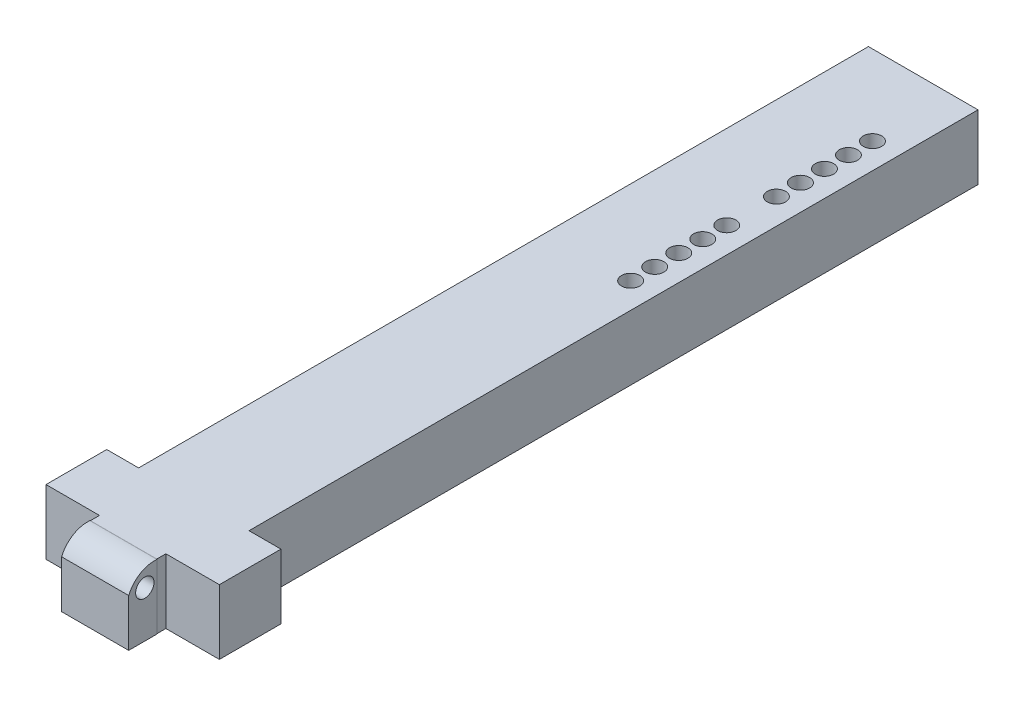
ISO-10303-21;
HEADER;
FILE_DESCRIPTION(('STEP AP214'),'2;1');
FILE_NAME('part.step','',(''),(''),'','','');
FILE_SCHEMA(('AUTOMOTIVE_DESIGN { 1 0 10303 214 1 1 1 1 }'));
ENDSEC;
DATA;
#1=APPLICATION_CONTEXT('core data for automotive mechanical design processes');
#2=APPLICATION_PROTOCOL_DEFINITION('international standard','automotive_design',2000,#1);
#3=PRODUCT_CONTEXT('',#1,'mechanical');
#4=PRODUCT('Part','Part','',(#3));
#5=PRODUCT_RELATED_PRODUCT_CATEGORY('part','',(#4));
#6=PRODUCT_DEFINITION_FORMATION('','',#4);
#7=PRODUCT_DEFINITION_CONTEXT('part definition',#1,'design');
#8=PRODUCT_DEFINITION('design','',#6,#7);
#9=PRODUCT_DEFINITION_SHAPE('','',#8);
#10=(LENGTH_UNIT() NAMED_UNIT(*) SI_UNIT(.MILLI.,.METRE.));
#11=(NAMED_UNIT(*) PLANE_ANGLE_UNIT() SI_UNIT($,.RADIAN.));
#12=(NAMED_UNIT(*) SI_UNIT($,.STERADIAN.) SOLID_ANGLE_UNIT());
#13=UNCERTAINTY_MEASURE_WITH_UNIT(LENGTH_MEASURE(1.E-05),#10,'distance_accuracy_value','');
#14=(GEOMETRIC_REPRESENTATION_CONTEXT(3) GLOBAL_UNCERTAINTY_ASSIGNED_CONTEXT((#13)) GLOBAL_UNIT_ASSIGNED_CONTEXT((#10,
#11,#12)) REPRESENTATION_CONTEXT('',''));
#15=CARTESIAN_POINT('',(0.,0.,0.));
#16=DIRECTION('',(0.,0.,1.));
#17=DIRECTION('',(1.,0.,0.));
#18=AXIS2_PLACEMENT_3D('',#15,#16,#17);
#19=CARTESIAN_POINT('',(0.,12.,0.));
#20=DIRECTION('',(0.,-1.,0.));
#21=DIRECTION('',(0.,0.,-1.));
#22=AXIS2_PLACEMENT_3D('',#19,#20,#21);
#23=PLANE('',#22);
#24=DIRECTION('',(0.,0.,1.));
#25=VECTOR('',#24,1.);
#26=CARTESIAN_POINT('',(-10.15,12.,-81.2029529089464));
#27=LINE('',#26,#25);
#28=CARTESIAN_POINT('',(-10.15,12.,-81.2029529089464));
#29=VERTEX_POINT('',#28);
#30=CARTESIAN_POINT('',(-10.15,12.,54.0044271440087));
#31=VERTEX_POINT('',#30);
#32=EDGE_CURVE('E200',#29,#31,#27,.T.);
#33=ORIENTED_EDGE('',*,*,#32,.T.);
#34=DIRECTION('',(-1.,0.,0.));
#35=VECTOR('',#34,1.);
#36=CARTESIAN_POINT('',(-10.15,12.,54.0044271440087));
#37=LINE('',#36,#35);
#38=CARTESIAN_POINT('',(-16.06,12.,54.0044271440087));
#39=VERTEX_POINT('',#38);
#40=EDGE_CURVE('E112',#31,#39,#37,.T.);
#41=ORIENTED_EDGE('',*,*,#40,.T.);
#42=DIRECTION('',(0.,0.,1.));
#43=VECTOR('',#42,1.);
#44=CARTESIAN_POINT('',(-16.06,12.,54.0044271440087));
#45=LINE('',#44,#43);
#46=CARTESIAN_POINT('',(-16.06,12.,65.2544271440087));
#47=VERTEX_POINT('',#46);
#48=EDGE_CURVE('E236',#39,#47,#45,.T.);
#49=ORIENTED_EDGE('',*,*,#48,.T.);
#50=DIRECTION('',(1.,0.,0.));
#51=VECTOR('',#50,1.);
#52=CARTESIAN_POINT('',(-6.15,12.,65.2544271440087));
#53=LINE('',#52,#51);
#54=CARTESIAN_POINT('',(-6.15,12.,65.2544271440087));
#55=VERTEX_POINT('',#54);
#56=EDGE_CURVE('E256',#47,#55,#53,.T.);
#57=ORIENTED_EDGE('',*,*,#56,.T.);
#58=DIRECTION('',(0.,0.,1.));
#59=VECTOR('',#58,1.);
#60=CARTESIAN_POINT('',(-6.15,12.,66.9344271440087));
#61=LINE('',#60,#59);
#62=CARTESIAN_POINT('',(-6.15,12.,66.9344271440087));
#63=VERTEX_POINT('',#62);
#64=EDGE_CURVE('E252',#55,#63,#61,.T.);
#65=ORIENTED_EDGE('',*,*,#64,.T.);
#66=DIRECTION('',(1.,0.,0.));
#67=VECTOR('',#66,1.);
#68=CARTESIAN_POINT('',(-6.15,12.,66.9344271440087));
#69=LINE('',#68,#67);
#70=CARTESIAN_POINT('',(6.15000000000001,12.,66.9344271440087));
#71=VERTEX_POINT('',#70);
#72=EDGE_CURVE('E255',#63,#71,#69,.T.);
#73=ORIENTED_EDGE('',*,*,#72,.T.);
#74=DIRECTION('',(0.,0.,-1.));
#75=VECTOR('',#74,1.);
#76=CARTESIAN_POINT('',(6.15000000000001,12.,65.2544271440087));
#77=LINE('',#76,#75);
#78=CARTESIAN_POINT('',(6.15000000000001,12.,65.2544271440087));
#79=VERTEX_POINT('',#78);
#80=EDGE_CURVE('E260',#71,#79,#77,.T.);
#81=ORIENTED_EDGE('',*,*,#80,.T.);
#82=DIRECTION('',(1.,0.,0.));
#83=VECTOR('',#82,1.);
#84=CARTESIAN_POINT('',(16.06,12.,65.2544271440087));
#85=LINE('',#84,#83);
#86=CARTESIAN_POINT('',(16.06,12.,65.2544271440087));
#87=VERTEX_POINT('',#86);
#88=EDGE_CURVE('E267',#79,#87,#85,.T.);
#89=ORIENTED_EDGE('',*,*,#88,.T.);
#90=DIRECTION('',(0.,0.,-1.));
#91=VECTOR('',#90,1.);
#92=CARTESIAN_POINT('',(16.06,12.,65.2544271440087));
#93=LINE('',#92,#91);
#94=CARTESIAN_POINT('',(16.06,12.,53.848636554426));
#95=VERTEX_POINT('',#94);
#96=EDGE_CURVE('E145',#87,#95,#93,.T.);
#97=ORIENTED_EDGE('',*,*,#96,.T.);
#98=DIRECTION('',(-1.,0.,0.));
#99=VECTOR('',#98,1.);
#100=CARTESIAN_POINT('',(16.06,12.,53.848636554426));
#101=LINE('',#100,#99);
#102=CARTESIAN_POINT('',(10.15,12.,53.848636554426));
#103=VERTEX_POINT('',#102);
#104=EDGE_CURVE('E139',#95,#103,#101,.T.);
#105=ORIENTED_EDGE('',*,*,#104,.T.);
#106=DIRECTION('',(0.,0.,-1.));
#107=VECTOR('',#106,1.);
#108=CARTESIAN_POINT('',(10.15,12.,-81.2029529089464));
#109=LINE('',#108,#107);
#110=CARTESIAN_POINT('',(10.15,12.,-81.2029529089464));
#111=VERTEX_POINT('',#110);
#112=EDGE_CURVE('E143',#103,#111,#109,.T.);
#113=ORIENTED_EDGE('',*,*,#112,.T.);
#114=DIRECTION('',(-1.,0.,0.));
#115=VECTOR('',#114,1.);
#116=CARTESIAN_POINT('',(-10.15,12.,-81.2029529089464));
#117=LINE('',#116,#115);
#118=EDGE_CURVE('E59',#111,#29,#117,.T.);
#119=ORIENTED_EDGE('',*,*,#118,.T.);
#120=EDGE_LOOP('',(#33,#41,#49,#57,#65,#73,#81,#89,#97,#105,#113,#119));
#121=FACE_BOUND('',#120,.T.);
#122=CARTESIAN_POINT('',(5.39999999999999,12.,-48.60403469007));
#123=DIRECTION('',(0.,1.,0.));
#124=DIRECTION('',(0.,0.,1.));
#125=AXIS2_PLACEMENT_3D('',#122,#123,#124);
#126=CIRCLE('',#125,1.7);
#127=CARTESIAN_POINT('',(5.39999999999999,12.,-46.90403469007));
#128=VERTEX_POINT('',#127);
#129=EDGE_CURVE('E172',#128,#128,#126,.T.);
#130=ORIENTED_EDGE('',*,*,#129,.F.);
#131=EDGE_LOOP('',(#130));
#132=FACE_BOUND('',#131,.T.);
#133=CARTESIAN_POINT('',(5.39999999999999,12.,-57.5040346889464));
#134=DIRECTION('',(0.,1.,0.));
#135=DIRECTION('',(0.,0.,1.));
#136=AXIS2_PLACEMENT_3D('',#133,#134,#135);
#137=CIRCLE('',#136,1.7);
#138=CARTESIAN_POINT('',(5.39999999999999,12.,-55.8040346889464));
#139=VERTEX_POINT('',#138);
#140=EDGE_CURVE('E508',#139,#139,#137,.T.);
#141=ORIENTED_EDGE('',*,*,#140,.F.);
#142=EDGE_LOOP('',(#141));
#143=FACE_BOUND('',#142,.T.);
#144=CARTESIAN_POINT('',(5.39999999999999,12.,-30.5040346889464));
#145=DIRECTION('',(0.,1.,0.));
#146=DIRECTION('',(0.,0.,1.));
#147=AXIS2_PLACEMENT_3D('',#144,#145,#146);
#148=CIRCLE('',#147,1.7);
#149=CARTESIAN_POINT('',(5.39999999999999,12.,-28.8040346889464));
#150=VERTEX_POINT('',#149);
#151=EDGE_CURVE('E500',#150,#150,#148,.T.);
#152=ORIENTED_EDGE('',*,*,#151,.F.);
#153=EDGE_LOOP('',(#152));
#154=FACE_BOUND('',#153,.T.);
#155=CARTESIAN_POINT('',(5.40009999999999,12.,-53.0540346889464));
#156=DIRECTION('',(0.,1.,0.));
#157=DIRECTION('',(0.,0.,1.));
#158=AXIS2_PLACEMENT_3D('',#155,#156,#157);
#159=CIRCLE('',#158,1.7);
#160=CARTESIAN_POINT('',(5.40009999999999,12.,-51.3540346889464));
#161=VERTEX_POINT('',#160);
#162=EDGE_CURVE('E492',#161,#161,#159,.T.);
#163=ORIENTED_EDGE('',*,*,#162,.F.);
#164=EDGE_LOOP('',(#163));
#165=FACE_BOUND('',#164,.T.);
#166=CARTESIAN_POINT('',(5.40009999999999,12.,-26.0540346889464));
#167=DIRECTION('',(0.,1.,0.));
#168=DIRECTION('',(0.,0.,1.));
#169=AXIS2_PLACEMENT_3D('',#166,#167,#168);
#170=CIRCLE('',#169,1.7);
#171=CARTESIAN_POINT('',(5.40009999999999,12.,-24.3540346889464));
#172=VERTEX_POINT('',#171);
#173=EDGE_CURVE('E484',#172,#172,#170,.T.);
#174=ORIENTED_EDGE('',*,*,#173,.F.);
#175=EDGE_LOOP('',(#174));
#176=FACE_BOUND('',#175,.T.);
#177=CARTESIAN_POINT('',(5.39999999999999,12.,-61.9540346889464));
#178=DIRECTION('',(0.,1.,0.));
#179=DIRECTION('',(0.,0.,1.));
#180=AXIS2_PLACEMENT_3D('',#177,#178,#179);
#181=CIRCLE('',#180,1.7);
#182=CARTESIAN_POINT('',(5.39999999999999,12.,-60.2540346889464));
#183=VERTEX_POINT('',#182);
#184=EDGE_CURVE('E476',#183,#183,#181,.T.);
#185=ORIENTED_EDGE('',*,*,#184,.F.);
#186=EDGE_LOOP('',(#185));
#187=FACE_BOUND('',#186,.T.);
#188=CARTESIAN_POINT('',(5.39994999999999,12.,-34.9540346889464));
#189=DIRECTION('',(0.,1.,0.));
#190=DIRECTION('',(0.,0.,1.));
#191=AXIS2_PLACEMENT_3D('',#188,#189,#190);
#192=CIRCLE('',#191,1.7);
#193=CARTESIAN_POINT('',(5.39994999999999,12.,-33.2540346889464));
#194=VERTEX_POINT('',#193);
#195=EDGE_CURVE('E468',#194,#194,#192,.T.);
#196=ORIENTED_EDGE('',*,*,#195,.F.);
#197=EDGE_LOOP('',(#196));
#198=FACE_BOUND('',#197,.T.);
#199=CARTESIAN_POINT('',(5.40004999999999,12.,-66.4040346886655));
#200=DIRECTION('',(0.,1.,0.));
#201=DIRECTION('',(0.,0.,1.));
#202=AXIS2_PLACEMENT_3D('',#199,#200,#201);
#203=CIRCLE('',#202,1.70000000000001);
#204=CARTESIAN_POINT('',(5.40004999999999,12.,-64.7040346886654));
#205=VERTEX_POINT('',#204);
#206=EDGE_CURVE('E460',#205,#205,#203,.T.);
#207=ORIENTED_EDGE('',*,*,#206,.F.);
#208=EDGE_LOOP('',(#207));
#209=FACE_BOUND('',#208,.T.);
#210=CARTESIAN_POINT('',(5.39999999999999,12.,-21.60403469007));
#211=DIRECTION('',(0.,1.,0.));
#212=DIRECTION('',(0.,0.,1.));
#213=AXIS2_PLACEMENT_3D('',#210,#211,#212);
#214=CIRCLE('',#213,1.7);
#215=CARTESIAN_POINT('',(5.39999999999999,12.,-19.90403469007));
#216=VERTEX_POINT('',#215);
#217=EDGE_CURVE('E452',#216,#216,#214,.T.);
#218=ORIENTED_EDGE('',*,*,#217,.F.);
#219=EDGE_LOOP('',(#218));
#220=FACE_BOUND('',#219,.T.);
#221=CARTESIAN_POINT('',(5.39999999999999,12.,-39.4040346886655));
#222=DIRECTION('',(0.,1.,0.));
#223=DIRECTION('',(0.,0.,1.));
#224=AXIS2_PLACEMENT_3D('',#221,#222,#223);
#225=CIRCLE('',#224,1.7);
#226=CARTESIAN_POINT('',(5.39999999999999,12.,-37.7040346886655));
#227=VERTEX_POINT('',#226);
#228=EDGE_CURVE('E444',#227,#227,#225,.T.);
#229=ORIENTED_EDGE('',*,*,#228,.F.);
#230=EDGE_LOOP('',(#229));
#231=FACE_BOUND('',#230,.T.);
#232=ADVANCED_FACE('F41',(#121,#132,#143,#154,#165,#176,#187,#198,#209,#220,#231),#23,.F.);
#233=CARTESIAN_POINT('',(0.,0.,0.));
#234=DIRECTION('',(0.,-1.,0.));
#235=DIRECTION('',(0.,0.,-1.));
#236=AXIS2_PLACEMENT_3D('',#233,#234,#235);
#237=PLANE('',#236);
#238=CARTESIAN_POINT('',(5.39999999999999,0.,-21.60403469007));
#239=DIRECTION('',(0.,1.,0.));
#240=DIRECTION('',(0.,0.,1.));
#241=AXIS2_PLACEMENT_3D('',#238,#239,#240);
#242=CIRCLE('',#241,1.7);
#243=CARTESIAN_POINT('',(5.39999999999999,0.,-19.90403469007));
#244=VERTEX_POINT('',#243);
#245=EDGE_CURVE('E448',#244,#244,#242,.T.);
#246=ORIENTED_EDGE('',*,*,#245,.T.);
#247=EDGE_LOOP('',(#246));
#248=FACE_BOUND('',#247,.T.);
#249=CARTESIAN_POINT('',(5.39994999999999,0.,-34.9540346889464));
#250=DIRECTION('',(0.,1.,0.));
#251=DIRECTION('',(0.,0.,1.));
#252=AXIS2_PLACEMENT_3D('',#249,#250,#251);
#253=CIRCLE('',#252,1.7);
#254=CARTESIAN_POINT('',(5.39994999999999,0.,-33.2540346889464));
#255=VERTEX_POINT('',#254);
#256=EDGE_CURVE('E464',#255,#255,#253,.T.);
#257=ORIENTED_EDGE('',*,*,#256,.T.);
#258=EDGE_LOOP('',(#257));
#259=FACE_BOUND('',#258,.T.);
#260=CARTESIAN_POINT('',(5.40009999999999,0.,-26.0540346889464));
#261=DIRECTION('',(0.,1.,0.));
#262=DIRECTION('',(0.,0.,1.));
#263=AXIS2_PLACEMENT_3D('',#260,#261,#262);
#264=CIRCLE('',#263,1.7);
#265=CARTESIAN_POINT('',(5.40009999999999,0.,-24.3540346889464));
#266=VERTEX_POINT('',#265);
#267=EDGE_CURVE('E480',#266,#266,#264,.T.);
#268=ORIENTED_EDGE('',*,*,#267,.T.);
#269=EDGE_LOOP('',(#268));
#270=FACE_BOUND('',#269,.T.);
#271=CARTESIAN_POINT('',(5.39999999999999,0.,-30.5040346889464));
#272=DIRECTION('',(0.,1.,0.));
#273=DIRECTION('',(0.,0.,1.));
#274=AXIS2_PLACEMENT_3D('',#271,#272,#273);
#275=CIRCLE('',#274,1.7);
#276=CARTESIAN_POINT('',(5.39999999999999,0.,-28.8040346889464));
#277=VERTEX_POINT('',#276);
#278=EDGE_CURVE('E496',#277,#277,#275,.T.);
#279=ORIENTED_EDGE('',*,*,#278,.T.);
#280=EDGE_LOOP('',(#279));
#281=FACE_BOUND('',#280,.T.);
#282=CARTESIAN_POINT('',(5.39999999999999,0.,-48.60403469007));
#283=DIRECTION('',(0.,1.,0.));
#284=DIRECTION('',(0.,0.,1.));
#285=AXIS2_PLACEMENT_3D('',#282,#283,#284);
#286=CIRCLE('',#285,1.7);
#287=CARTESIAN_POINT('',(5.39999999999999,0.,-46.90403469007));
#288=VERTEX_POINT('',#287);
#289=EDGE_CURVE('E512',#288,#288,#286,.T.);
#290=ORIENTED_EDGE('',*,*,#289,.T.);
#291=EDGE_LOOP('',(#290));
#292=FACE_BOUND('',#291,.T.);
#293=DIRECTION('',(0.,0.,1.));
#294=VECTOR('',#293,1.);
#295=CARTESIAN_POINT('',(-10.15,0.,-81.2029529089464));
#296=LINE('',#295,#294);
#297=CARTESIAN_POINT('',(-10.15,0.,-81.2029529089464));
#298=VERTEX_POINT('',#297);
#299=CARTESIAN_POINT('',(-10.15,0.,54.0044271440087));
#300=VERTEX_POINT('',#299);
#301=EDGE_CURVE('E167',#298,#300,#296,.T.);
#302=ORIENTED_EDGE('',*,*,#301,.F.);
#303=DIRECTION('',(-1.,0.,0.));
#304=VECTOR('',#303,1.);
#305=CARTESIAN_POINT('',(-10.15,0.,-81.2029529089464));
#306=LINE('',#305,#304);
#307=CARTESIAN_POINT('',(10.15,0.,-81.2029529089464));
#308=VERTEX_POINT('',#307);
#309=EDGE_CURVE('E104',#308,#298,#306,.T.);
#310=ORIENTED_EDGE('',*,*,#309,.F.);
#311=DIRECTION('',(0.,0.,-1.));
#312=VECTOR('',#311,1.);
#313=CARTESIAN_POINT('',(10.15,0.,-81.2029529089464));
#314=LINE('',#313,#312);
#315=CARTESIAN_POINT('',(10.15,0.,53.848636554426));
#316=VERTEX_POINT('',#315);
#317=EDGE_CURVE('E98',#316,#308,#314,.T.);
#318=ORIENTED_EDGE('',*,*,#317,.F.);
#319=DIRECTION('',(-1.,0.,0.));
#320=VECTOR('',#319,1.);
#321=CARTESIAN_POINT('',(16.06,0.,53.848636554426));
#322=LINE('',#321,#320);
#323=CARTESIAN_POINT('',(16.06,0.,53.848636554426));
#324=VERTEX_POINT('',#323);
#325=EDGE_CURVE('E154',#324,#316,#322,.T.);
#326=ORIENTED_EDGE('',*,*,#325,.F.);
#327=DIRECTION('',(0.,0.,-1.));
#328=VECTOR('',#327,1.);
#329=CARTESIAN_POINT('',(16.06,0.,65.2544271440087));
#330=LINE('',#329,#328);
#331=CARTESIAN_POINT('',(16.06,0.,65.2544271440087));
#332=VERTEX_POINT('',#331);
#333=EDGE_CURVE('E191',#332,#324,#330,.T.);
#334=ORIENTED_EDGE('',*,*,#333,.F.);
#335=DIRECTION('',(1.,0.,0.));
#336=VECTOR('',#335,1.);
#337=CARTESIAN_POINT('',(16.06,0.,65.2544271440087));
#338=LINE('',#337,#336);
#339=CARTESIAN_POINT('',(6.15000000000001,0.,65.2544271440087));
#340=VERTEX_POINT('',#339);
#341=EDGE_CURVE('E188',#340,#332,#338,.T.);
#342=ORIENTED_EDGE('',*,*,#341,.F.);
#343=DIRECTION('',(0.,0.,-1.));
#344=VECTOR('',#343,1.);
#345=CARTESIAN_POINT('',(6.15000000000001,0.,65.2544271440087));
#346=LINE('',#345,#344);
#347=CARTESIAN_POINT('',(6.15000000000001,0.,66.9344271440087));
#348=VERTEX_POINT('',#347);
#349=EDGE_CURVE('E185',#348,#340,#346,.T.);
#350=ORIENTED_EDGE('',*,*,#349,.F.);
#351=DIRECTION('',(-1.,0.,0.));
#352=VECTOR('',#351,1.);
#353=CARTESIAN_POINT('',(6.2125,0.,66.9344271440087));
#354=LINE('',#353,#352);
#355=CARTESIAN_POINT('',(6.2125,0.,66.9344271440087));
#356=VERTEX_POINT('',#355);
#357=EDGE_CURVE('E435',#356,#348,#354,.T.);
#358=ORIENTED_EDGE('',*,*,#357,.F.);
#359=DIRECTION('',(0.,0.,-1.));
#360=VECTOR('',#359,1.);
#361=CARTESIAN_POINT('',(6.2125,0.,66.9344271440087));
#362=LINE('',#361,#360);
#363=CARTESIAN_POINT('',(6.2125,0.,72.2072929333866));
#364=VERTEX_POINT('',#363);
#365=EDGE_CURVE('E386',#364,#356,#362,.T.);
#366=ORIENTED_EDGE('',*,*,#365,.F.);
#367=DIRECTION('',(-1.,0.,0.));
#368=VECTOR('',#367,1.);
#369=CARTESIAN_POINT('',(6.2125,0.,72.2072929333866));
#370=LINE('',#369,#368);
#371=CARTESIAN_POINT('',(-6.2125,0.,72.2072929333866));
#372=VERTEX_POINT('',#371);
#373=EDGE_CURVE('E439',#364,#372,#370,.T.);
#374=ORIENTED_EDGE('',*,*,#373,.T.);
#375=DIRECTION('',(0.,0.,-1.));
#376=VECTOR('',#375,1.);
#377=CARTESIAN_POINT('',(-6.2125,0.,66.9344271440087));
#378=LINE('',#377,#376);
#379=CARTESIAN_POINT('',(-6.2125,0.,66.9344271440087));
#380=VERTEX_POINT('',#379);
#381=EDGE_CURVE('E379',#372,#380,#378,.T.);
#382=ORIENTED_EDGE('',*,*,#381,.T.);
#383=CARTESIAN_POINT('',(-6.15,0.,66.9344271440087));
#384=VERTEX_POINT('',#383);
#385=EDGE_CURVE('E434',#384,#380,#354,.T.);
#386=ORIENTED_EDGE('',*,*,#385,.F.);
#387=DIRECTION('',(0.,0.,1.));
#388=VECTOR('',#387,1.);
#389=CARTESIAN_POINT('',(-6.15,0.,66.9344271440087));
#390=LINE('',#389,#388);
#391=CARTESIAN_POINT('',(-6.15,0.,65.2544271440087));
#392=VERTEX_POINT('',#391);
#393=EDGE_CURVE('E181',#392,#384,#390,.T.);
#394=ORIENTED_EDGE('',*,*,#393,.F.);
#395=DIRECTION('',(1.,0.,0.));
#396=VECTOR('',#395,1.);
#397=CARTESIAN_POINT('',(-6.15,0.,65.2544271440087));
#398=LINE('',#397,#396);
#399=CARTESIAN_POINT('',(-16.06,0.,65.2544271440087));
#400=VERTEX_POINT('',#399);
#401=EDGE_CURVE('E178',#400,#392,#398,.T.);
#402=ORIENTED_EDGE('',*,*,#401,.F.);
#403=DIRECTION('',(0.,0.,1.));
#404=VECTOR('',#403,1.);
#405=CARTESIAN_POINT('',(-16.06,0.,54.0044271440087));
#406=LINE('',#405,#404);
#407=CARTESIAN_POINT('',(-16.06,0.,54.0044271440087));
#408=VERTEX_POINT('',#407);
#409=EDGE_CURVE('E175',#408,#400,#406,.T.);
#410=ORIENTED_EDGE('',*,*,#409,.F.);
#411=DIRECTION('',(-1.,0.,0.));
#412=VECTOR('',#411,1.);
#413=CARTESIAN_POINT('',(-10.15,0.,54.0044271440087));
#414=LINE('',#413,#412);
#415=EDGE_CURVE('E171',#300,#408,#414,.T.);
#416=ORIENTED_EDGE('',*,*,#415,.F.);
#417=EDGE_LOOP('',(#302,#310,#318,#326,#334,#342,#350,#358,#366,#374,#382,#386,#394,#402,#410,#416));
#418=FACE_BOUND('',#417,.T.);
#419=CARTESIAN_POINT('',(5.39999999999999,0.,-57.5040346889464));
#420=DIRECTION('',(0.,1.,0.));
#421=DIRECTION('',(0.,0.,1.));
#422=AXIS2_PLACEMENT_3D('',#419,#420,#421);
#423=CIRCLE('',#422,1.7);
#424=CARTESIAN_POINT('',(5.39999999999999,0.,-55.8040346889464));
#425=VERTEX_POINT('',#424);
#426=EDGE_CURVE('E504',#425,#425,#423,.T.);
#427=ORIENTED_EDGE('',*,*,#426,.T.);
#428=EDGE_LOOP('',(#427));
#429=FACE_BOUND('',#428,.T.);
#430=CARTESIAN_POINT('',(5.40009999999999,0.,-53.0540346889464));
#431=DIRECTION('',(0.,1.,0.));
#432=DIRECTION('',(0.,0.,1.));
#433=AXIS2_PLACEMENT_3D('',#430,#431,#432);
#434=CIRCLE('',#433,1.7);
#435=CARTESIAN_POINT('',(5.40009999999999,0.,-51.3540346889464));
#436=VERTEX_POINT('',#435);
#437=EDGE_CURVE('E488',#436,#436,#434,.T.);
#438=ORIENTED_EDGE('',*,*,#437,.T.);
#439=EDGE_LOOP('',(#438));
#440=FACE_BOUND('',#439,.T.);
#441=CARTESIAN_POINT('',(5.39999999999999,0.,-61.9540346889464));
#442=DIRECTION('',(0.,1.,0.));
#443=DIRECTION('',(0.,0.,1.));
#444=AXIS2_PLACEMENT_3D('',#441,#442,#443);
#445=CIRCLE('',#444,1.7);
#446=CARTESIAN_POINT('',(5.39999999999999,0.,-60.2540346889464));
#447=VERTEX_POINT('',#446);
#448=EDGE_CURVE('E472',#447,#447,#445,.T.);
#449=ORIENTED_EDGE('',*,*,#448,.T.);
#450=EDGE_LOOP('',(#449));
#451=FACE_BOUND('',#450,.T.);
#452=CARTESIAN_POINT('',(5.40004999999999,0.,-66.4040346886655));
#453=DIRECTION('',(0.,1.,0.));
#454=DIRECTION('',(0.,0.,1.));
#455=AXIS2_PLACEMENT_3D('',#452,#453,#454);
#456=CIRCLE('',#455,1.70000000000001);
#457=CARTESIAN_POINT('',(5.40004999999999,0.,-64.7040346886654));
#458=VERTEX_POINT('',#457);
#459=EDGE_CURVE('E456',#458,#458,#456,.T.);
#460=ORIENTED_EDGE('',*,*,#459,.T.);
#461=EDGE_LOOP('',(#460));
#462=FACE_BOUND('',#461,.T.);
#463=CARTESIAN_POINT('',(5.39999999999999,0.,-39.4040346886655));
#464=DIRECTION('',(0.,1.,0.));
#465=DIRECTION('',(0.,0.,1.));
#466=AXIS2_PLACEMENT_3D('',#463,#464,#465);
#467=CIRCLE('',#466,1.7);
#468=CARTESIAN_POINT('',(5.39999999999999,0.,-37.7040346886655));
#469=VERTEX_POINT('',#468);
#470=EDGE_CURVE('E443',#469,#469,#467,.T.);
#471=ORIENTED_EDGE('',*,*,#470,.T.);
#472=EDGE_LOOP('',(#471));
#473=FACE_BOUND('',#472,.T.);
#474=ADVANCED_FACE('F240',(#248,#259,#270,#281,#292,#418,#429,#440,#451,#462,#473),#237,.T.);
#475=CARTESIAN_POINT('',(-10.15,12.,-81.2029529089464));
#476=DIRECTION('',(1.,0.,0.));
#477=DIRECTION('',(0.,0.,-1.));
#478=AXIS2_PLACEMENT_3D('',#475,#476,#477);
#479=PLANE('',#478);
#480=ORIENTED_EDGE('',*,*,#301,.T.);
#481=DIRECTION('',(0.,-1.,0.));
#482=VECTOR('',#481,1.);
#483=CARTESIAN_POINT('',(-10.15,12.,54.0044271440087));
#484=LINE('',#483,#482);
#485=EDGE_CURVE('E11',#31,#300,#484,.T.);
#486=ORIENTED_EDGE('',*,*,#485,.F.);
#487=ORIENTED_EDGE('',*,*,#32,.F.);
#488=DIRECTION('',(0.,-1.,0.));
#489=VECTOR('',#488,1.);
#490=CARTESIAN_POINT('',(-10.15,12.,-81.2029529089464));
#491=LINE('',#490,#489);
#492=EDGE_CURVE('E163',#29,#298,#491,.T.);
#493=ORIENTED_EDGE('',*,*,#492,.T.);
#494=EDGE_LOOP('',(#480,#486,#487,#493));
#495=FACE_BOUND('',#494,.T.);
#496=ADVANCED_FACE('F43',(#495),#479,.F.);
#497=CARTESIAN_POINT('',(-10.15,12.,54.0044271440087));
#498=DIRECTION('',(0.,0.,1.));
#499=DIRECTION('',(1.,0.,0.));
#500=AXIS2_PLACEMENT_3D('',#497,#498,#499);
#501=PLANE('',#500);
#502=ORIENTED_EDGE('',*,*,#415,.T.);
#503=DIRECTION('',(0.,-1.,0.));
#504=VECTOR('',#503,1.);
#505=CARTESIAN_POINT('',(-16.06,12.,54.0044271440087));
#506=LINE('',#505,#504);
#507=EDGE_CURVE('E51',#39,#408,#506,.T.);
#508=ORIENTED_EDGE('',*,*,#507,.F.);
#509=ORIENTED_EDGE('',*,*,#40,.F.);
#510=ORIENTED_EDGE('',*,*,#485,.T.);
#511=EDGE_LOOP('',(#502,#508,#509,#510));
#512=FACE_BOUND('',#511,.T.);
#513=ADVANCED_FACE('F584',(#512),#501,.F.);
#514=CARTESIAN_POINT('',(-16.06,12.,54.0044271440087));
#515=DIRECTION('',(1.,0.,0.));
#516=DIRECTION('',(0.,0.,-1.));
#517=AXIS2_PLACEMENT_3D('',#514,#515,#516);
#518=PLANE('',#517);
#519=ORIENTED_EDGE('',*,*,#409,.T.);
#520=DIRECTION('',(0.,-1.,0.));
#521=VECTOR('',#520,1.);
#522=CARTESIAN_POINT('',(-16.06,12.,65.2544271440087));
#523=LINE('',#522,#521);
#524=EDGE_CURVE('E226',#47,#400,#523,.T.);
#525=ORIENTED_EDGE('',*,*,#524,.F.);
#526=ORIENTED_EDGE('',*,*,#48,.F.);
#527=ORIENTED_EDGE('',*,*,#507,.T.);
#528=EDGE_LOOP('',(#519,#525,#526,#527));
#529=FACE_BOUND('',#528,.T.);
#530=ADVANCED_FACE('F234',(#529),#518,.F.);
#531=CARTESIAN_POINT('',(-6.15,12.,65.2544271440087));
#532=DIRECTION('',(0.,0.,-1.));
#533=DIRECTION('',(-1.,0.,0.));
#534=AXIS2_PLACEMENT_3D('',#531,#532,#533);
#535=PLANE('',#534);
#536=ORIENTED_EDGE('',*,*,#401,.T.);
#537=DIRECTION('',(0.,-1.,0.));
#538=VECTOR('',#537,1.);
#539=CARTESIAN_POINT('',(-6.15,12.,65.2544271440087));
#540=LINE('',#539,#538);
#541=EDGE_CURVE('E222',#55,#392,#540,.T.);
#542=ORIENTED_EDGE('',*,*,#541,.F.);
#543=ORIENTED_EDGE('',*,*,#56,.F.);
#544=ORIENTED_EDGE('',*,*,#524,.T.);
#545=EDGE_LOOP('',(#536,#542,#543,#544));
#546=FACE_BOUND('',#545,.T.);
#547=ADVANCED_FACE('F246',(#546),#535,.F.);
#548=CARTESIAN_POINT('',(-6.15,12.,66.9344271440087));
#549=DIRECTION('',(1.,0.,0.));
#550=DIRECTION('',(0.,0.,-1.));
#551=AXIS2_PLACEMENT_3D('',#548,#549,#550);
#552=PLANE('',#551);
#553=ORIENTED_EDGE('',*,*,#393,.T.);
#554=DIRECTION('',(0.,-1.,0.));
#555=VECTOR('',#554,1.);
#556=CARTESIAN_POINT('',(-6.15,12.,66.9344271440087));
#557=LINE('',#556,#555);
#558=EDGE_CURVE('E218',#63,#384,#557,.T.);
#559=ORIENTED_EDGE('',*,*,#558,.F.);
#560=ORIENTED_EDGE('',*,*,#64,.F.);
#561=ORIENTED_EDGE('',*,*,#541,.T.);
#562=EDGE_LOOP('',(#553,#559,#560,#561));
#563=FACE_BOUND('',#562,.T.);
#564=ADVANCED_FACE('F250',(#563),#552,.F.);
#565=CARTESIAN_POINT('',(6.15000000000001,12.,65.2544271440087));
#566=DIRECTION('',(-1.,0.,0.));
#567=DIRECTION('',(0.,0.,1.));
#568=AXIS2_PLACEMENT_3D('',#565,#566,#567);
#569=PLANE('',#568);
#570=ORIENTED_EDGE('',*,*,#349,.T.);
#571=DIRECTION('',(0.,-1.,0.));
#572=VECTOR('',#571,1.);
#573=CARTESIAN_POINT('',(6.15000000000001,12.,65.2544271440087));
#574=LINE('',#573,#572);
#575=EDGE_CURVE('E211',#79,#340,#574,.T.);
#576=ORIENTED_EDGE('',*,*,#575,.F.);
#577=ORIENTED_EDGE('',*,*,#80,.F.);
#578=DIRECTION('',(0.,-1.,0.));
#579=VECTOR('',#578,1.);
#580=CARTESIAN_POINT('',(6.15000000000001,12.,66.9344271440087));
#581=LINE('',#580,#579);
#582=EDGE_CURVE('E215',#71,#348,#581,.T.);
#583=ORIENTED_EDGE('',*,*,#582,.T.);
#584=EDGE_LOOP('',(#570,#576,#577,#583));
#585=FACE_BOUND('',#584,.T.);
#586=ADVANCED_FACE('F570',(#585),#569,.F.);
#587=CARTESIAN_POINT('',(16.06,12.,65.2544271440087));
#588=DIRECTION('',(0.,0.,-1.));
#589=DIRECTION('',(-1.,0.,0.));
#590=AXIS2_PLACEMENT_3D('',#587,#588,#589);
#591=PLANE('',#590);
#592=ORIENTED_EDGE('',*,*,#341,.T.);
#593=DIRECTION('',(0.,-1.,0.));
#594=VECTOR('',#593,1.);
#595=CARTESIAN_POINT('',(16.06,12.,65.2544271440087));
#596=LINE('',#595,#594);
#597=EDGE_CURVE('E207',#87,#332,#596,.T.);
#598=ORIENTED_EDGE('',*,*,#597,.F.);
#599=ORIENTED_EDGE('',*,*,#88,.F.);
#600=ORIENTED_EDGE('',*,*,#575,.T.);
#601=EDGE_LOOP('',(#592,#598,#599,#600));
#602=FACE_BOUND('',#601,.T.);
#603=ADVANCED_FACE('F275',(#602),#591,.F.);
#604=CARTESIAN_POINT('',(16.06,12.,65.2544271440087));
#605=DIRECTION('',(-1.,0.,0.));
#606=DIRECTION('',(0.,0.,1.));
#607=AXIS2_PLACEMENT_3D('',#604,#605,#606);
#608=PLANE('',#607);
#609=ORIENTED_EDGE('',*,*,#333,.T.);
#610=DIRECTION('',(0.,-1.,0.));
#611=VECTOR('',#610,1.);
#612=CARTESIAN_POINT('',(16.06,12.,53.848636554426));
#613=LINE('',#612,#611);
#614=EDGE_CURVE('E156',#95,#324,#613,.T.);
#615=ORIENTED_EDGE('',*,*,#614,.F.);
#616=ORIENTED_EDGE('',*,*,#96,.F.);
#617=ORIENTED_EDGE('',*,*,#597,.T.);
#618=EDGE_LOOP('',(#609,#615,#616,#617));
#619=FACE_BOUND('',#618,.T.);
#620=ADVANCED_FACE('F279',(#619),#608,.F.);
#621=CARTESIAN_POINT('',(16.06,12.,53.848636554426));
#622=DIRECTION('',(0.,0.,1.));
#623=DIRECTION('',(1.,0.,0.));
#624=AXIS2_PLACEMENT_3D('',#621,#622,#623);
#625=PLANE('',#624);
#626=ORIENTED_EDGE('',*,*,#325,.T.);
#627=DIRECTION('',(0.,-1.,0.));
#628=VECTOR('',#627,1.);
#629=CARTESIAN_POINT('',(10.15,12.,53.848636554426));
#630=LINE('',#629,#628);
#631=EDGE_CURVE('E151',#103,#316,#630,.T.);
#632=ORIENTED_EDGE('',*,*,#631,.F.);
#633=ORIENTED_EDGE('',*,*,#104,.F.);
#634=ORIENTED_EDGE('',*,*,#614,.T.);
#635=EDGE_LOOP('',(#626,#632,#633,#634));
#636=FACE_BOUND('',#635,.T.);
#637=ADVANCED_FACE('F152',(#636),#625,.F.);
#638=CARTESIAN_POINT('',(10.15,12.,-81.2029529089464));
#639=DIRECTION('',(-1.,0.,0.));
#640=DIRECTION('',(0.,0.,1.));
#641=AXIS2_PLACEMENT_3D('',#638,#639,#640);
#642=PLANE('',#641);
#643=ORIENTED_EDGE('',*,*,#317,.T.);
#644=DIRECTION('',(0.,-1.,0.));
#645=VECTOR('',#644,1.);
#646=CARTESIAN_POINT('',(10.15,12.,-81.2029529089464));
#647=LINE('',#646,#645);
#648=EDGE_CURVE('E157',#111,#308,#647,.T.);
#649=ORIENTED_EDGE('',*,*,#648,.F.);
#650=ORIENTED_EDGE('',*,*,#112,.F.);
#651=ORIENTED_EDGE('',*,*,#631,.T.);
#652=EDGE_LOOP('',(#643,#649,#650,#651));
#653=FACE_BOUND('',#652,.T.);
#654=ADVANCED_FACE('F159',(#653),#642,.F.);
#655=CARTESIAN_POINT('',(-10.15,12.,-81.2029529089464));
#656=DIRECTION('',(0.,0.,1.));
#657=DIRECTION('',(1.,0.,0.));
#658=AXIS2_PLACEMENT_3D('',#655,#656,#657);
#659=PLANE('',#658);
#660=ORIENTED_EDGE('',*,*,#309,.T.);
#661=ORIENTED_EDGE('',*,*,#492,.F.);
#662=ORIENTED_EDGE('',*,*,#118,.F.);
#663=ORIENTED_EDGE('',*,*,#648,.T.);
#664=EDGE_LOOP('',(#660,#661,#662,#663));
#665=FACE_BOUND('',#664,.T.);
#666=ADVANCED_FACE('F283',(#665),#659,.F.);
#667=CARTESIAN_POINT('',(5.39999999999999,12.,-48.60403469007));
#668=DIRECTION('',(0.,-1.,0.));
#669=DIRECTION('',(0.,0.,-1.));
#670=AXIS2_PLACEMENT_3D('',#667,#668,#669);
#671=CYLINDRICAL_SURFACE('',#670,1.7);
#672=ORIENTED_EDGE('',*,*,#129,.T.);
#673=EDGE_LOOP('',(#672));
#674=FACE_BOUND('',#673,.T.);
#675=ORIENTED_EDGE('',*,*,#289,.F.);
#676=EDGE_LOOP('',(#675));
#677=FACE_BOUND('',#676,.T.);
#678=ADVANCED_FACE('F285',(#674,#677),#671,.F.);
#679=CARTESIAN_POINT('',(5.39999999999999,12.,-57.5040346889464));
#680=DIRECTION('',(0.,-1.,0.));
#681=DIRECTION('',(0.,0.,-1.));
#682=AXIS2_PLACEMENT_3D('',#679,#680,#681);
#683=CYLINDRICAL_SURFACE('',#682,1.7);
#684=ORIENTED_EDGE('',*,*,#140,.T.);
#685=EDGE_LOOP('',(#684));
#686=FACE_BOUND('',#685,.T.);
#687=ORIENTED_EDGE('',*,*,#426,.F.);
#688=EDGE_LOOP('',(#687));
#689=FACE_BOUND('',#688,.T.);
#690=ADVANCED_FACE('F291',(#686,#689),#683,.F.);
#691=CARTESIAN_POINT('',(5.39999999999999,12.,-30.5040346889464));
#692=DIRECTION('',(0.,-1.,0.));
#693=DIRECTION('',(0.,0.,-1.));
#694=AXIS2_PLACEMENT_3D('',#691,#692,#693);
#695=CYLINDRICAL_SURFACE('',#694,1.7);
#696=ORIENTED_EDGE('',*,*,#151,.T.);
#697=EDGE_LOOP('',(#696));
#698=FACE_BOUND('',#697,.T.);
#699=ORIENTED_EDGE('',*,*,#278,.F.);
#700=EDGE_LOOP('',(#699));
#701=FACE_BOUND('',#700,.T.);
#702=ADVANCED_FACE('F305',(#698,#701),#695,.F.);
#703=CARTESIAN_POINT('',(5.40009999999999,12.,-53.0540346889464));
#704=DIRECTION('',(0.,-1.,0.));
#705=DIRECTION('',(0.,0.,-1.));
#706=AXIS2_PLACEMENT_3D('',#703,#704,#705);
#707=CYLINDRICAL_SURFACE('',#706,1.7);
#708=ORIENTED_EDGE('',*,*,#162,.T.);
#709=EDGE_LOOP('',(#708));
#710=FACE_BOUND('',#709,.T.);
#711=ORIENTED_EDGE('',*,*,#437,.F.);
#712=EDGE_LOOP('',(#711));
#713=FACE_BOUND('',#712,.T.);
#714=ADVANCED_FACE('F309',(#710,#713),#707,.F.);
#715=CARTESIAN_POINT('',(5.40009999999999,12.,-26.0540346889464));
#716=DIRECTION('',(0.,-1.,0.));
#717=DIRECTION('',(0.,0.,-1.));
#718=AXIS2_PLACEMENT_3D('',#715,#716,#717);
#719=CYLINDRICAL_SURFACE('',#718,1.7);
#720=ORIENTED_EDGE('',*,*,#173,.T.);
#721=EDGE_LOOP('',(#720));
#722=FACE_BOUND('',#721,.T.);
#723=ORIENTED_EDGE('',*,*,#267,.F.);
#724=EDGE_LOOP('',(#723));
#725=FACE_BOUND('',#724,.T.);
#726=ADVANCED_FACE('F313',(#722,#725),#719,.F.);
#727=CARTESIAN_POINT('',(5.39999999999999,12.,-61.9540346889464));
#728=DIRECTION('',(0.,-1.,0.));
#729=DIRECTION('',(0.,0.,-1.));
#730=AXIS2_PLACEMENT_3D('',#727,#728,#729);
#731=CYLINDRICAL_SURFACE('',#730,1.7);
#732=ORIENTED_EDGE('',*,*,#184,.T.);
#733=EDGE_LOOP('',(#732));
#734=FACE_BOUND('',#733,.T.);
#735=ORIENTED_EDGE('',*,*,#448,.F.);
#736=EDGE_LOOP('',(#735));
#737=FACE_BOUND('',#736,.T.);
#738=ADVANCED_FACE('F317',(#734,#737),#731,.F.);
#739=CARTESIAN_POINT('',(5.39994999999999,12.,-34.9540346889464));
#740=DIRECTION('',(0.,-1.,0.));
#741=DIRECTION('',(0.,0.,-1.));
#742=AXIS2_PLACEMENT_3D('',#739,#740,#741);
#743=CYLINDRICAL_SURFACE('',#742,1.7);
#744=ORIENTED_EDGE('',*,*,#195,.T.);
#745=EDGE_LOOP('',(#744));
#746=FACE_BOUND('',#745,.T.);
#747=ORIENTED_EDGE('',*,*,#256,.F.);
#748=EDGE_LOOP('',(#747));
#749=FACE_BOUND('',#748,.T.);
#750=ADVANCED_FACE('F321',(#746,#749),#743,.F.);
#751=CARTESIAN_POINT('',(5.40004999999999,12.,-66.4040346886655));
#752=DIRECTION('',(0.,-1.,0.));
#753=DIRECTION('',(0.,0.,-1.));
#754=AXIS2_PLACEMENT_3D('',#751,#752,#753);
#755=CYLINDRICAL_SURFACE('',#754,1.70000000000001);
#756=ORIENTED_EDGE('',*,*,#206,.T.);
#757=EDGE_LOOP('',(#756));
#758=FACE_BOUND('',#757,.T.);
#759=ORIENTED_EDGE('',*,*,#459,.F.);
#760=EDGE_LOOP('',(#759));
#761=FACE_BOUND('',#760,.T.);
#762=ADVANCED_FACE('F325',(#758,#761),#755,.F.);
#763=CARTESIAN_POINT('',(5.39999999999999,12.,-21.60403469007));
#764=DIRECTION('',(0.,-1.,0.));
#765=DIRECTION('',(0.,0.,-1.));
#766=AXIS2_PLACEMENT_3D('',#763,#764,#765);
#767=CYLINDRICAL_SURFACE('',#766,1.7);
#768=ORIENTED_EDGE('',*,*,#217,.T.);
#769=EDGE_LOOP('',(#768));
#770=FACE_BOUND('',#769,.T.);
#771=ORIENTED_EDGE('',*,*,#245,.F.);
#772=EDGE_LOOP('',(#771));
#773=FACE_BOUND('',#772,.T.);
#774=ADVANCED_FACE('F329',(#770,#773),#767,.F.);
#775=CARTESIAN_POINT('',(5.39999999999999,12.,-39.4040346886655));
#776=DIRECTION('',(0.,-1.,0.));
#777=DIRECTION('',(0.,0.,-1.));
#778=AXIS2_PLACEMENT_3D('',#775,#776,#777);
#779=CYLINDRICAL_SURFACE('',#778,1.7);
#780=ORIENTED_EDGE('',*,*,#228,.T.);
#781=EDGE_LOOP('',(#780));
#782=FACE_BOUND('',#781,.T.);
#783=ORIENTED_EDGE('',*,*,#470,.F.);
#784=EDGE_LOOP('',(#783));
#785=FACE_BOUND('',#784,.T.);
#786=ADVANCED_FACE('F333',(#782,#785),#779,.F.);
#787=CARTESIAN_POINT('',(6.2125,12.,66.9344271440087));
#788=DIRECTION('',(0.,0.,1.));
#789=DIRECTION('',(1.,0.,0.));
#790=AXIS2_PLACEMENT_3D('',#787,#788,#789);
#791=PLANE('',#790);
#792=DIRECTION('',(-1.,0.,0.));
#793=VECTOR('',#792,1.);
#794=CARTESIAN_POINT('',(6.2125,12.,66.9344271440087));
#795=LINE('',#794,#793);
#796=CARTESIAN_POINT('',(-6.2125,12.,66.9344271440087));
#797=VERTEX_POINT('',#796);
#798=EDGE_CURVE('E429',#63,#797,#795,.T.);
#799=ORIENTED_EDGE('',*,*,#798,.F.);
#800=ORIENTED_EDGE('',*,*,#558,.T.);
#801=ORIENTED_EDGE('',*,*,#385,.T.);
#802=DIRECTION('',(0.,1.,0.));
#803=VECTOR('',#802,1.);
#804=CARTESIAN_POINT('',(-6.2125,12.,66.9344271440087));
#805=LINE('',#804,#803);
#806=EDGE_CURVE('E407',#380,#797,#805,.T.);
#807=ORIENTED_EDGE('',*,*,#806,.T.);
#808=EDGE_LOOP('',(#799,#800,#801,#807));
#809=FACE_BOUND('',#808,.T.);
#810=ADVANCED_FACE('F337',(#809),#791,.F.);
#811=CARTESIAN_POINT('',(6.2125,6.80776509962225,67.3983902751546));
#812=DIRECTION('',(-1.,0.,0.));
#813=DIRECTION('',(0.,0.,1.));
#814=AXIS2_PLACEMENT_3D('',#811,#812,#813);
#815=PLANE('',#814);
#816=DIRECTION('',(0.,-1.,0.));
#817=VECTOR('',#816,1.);
#818=CARTESIAN_POINT('',(6.2125,0.,72.2072929333866));
#819=LINE('',#818,#817);
#820=CARTESIAN_POINT('',(6.2125,8.80966506907478,72.2072929333866));
#821=VERTEX_POINT('',#820);
#822=EDGE_CURVE('E382',#821,#364,#819,.T.);
#823=ORIENTED_EDGE('',*,*,#822,.T.);
#824=ORIENTED_EDGE('',*,*,#365,.T.);
#825=DIRECTION('',(0.,1.,0.));
#826=VECTOR('',#825,1.);
#827=CARTESIAN_POINT('',(6.2125,12.,66.9344271440087));
#828=LINE('',#827,#826);
#829=CARTESIAN_POINT('',(6.2125,12.,66.9344271440087));
#830=VERTEX_POINT('',#829);
#831=EDGE_CURVE('E391',#356,#830,#828,.T.);
#832=ORIENTED_EDGE('',*,*,#831,.T.);
#833=DIRECTION('',(0.,-0.00781324003835743,0.999969476174199));
#834=VECTOR('',#833,1.);
#835=CARTESIAN_POINT('',(6.2125,11.9996650690748,66.9772929333866));
#836=LINE('',#835,#834);
#837=CARTESIAN_POINT('',(6.2125,11.9996650690748,66.9772929333866));
#838=VERTEX_POINT('',#837);
#839=EDGE_CURVE('E395',#830,#838,#836,.T.);
#840=ORIENTED_EDGE('',*,*,#839,.T.);
#841=CARTESIAN_POINT('',(6.2125,6.80776509962225,67.3983902751546));
#842=DIRECTION('',(1.,0.,0.));
#843=DIRECTION('',(0.,0.,1.));
#844=AXIS2_PLACEMENT_3D('',#841,#842,#843);
#845=CIRCLE('',#844,5.20894886364277);
#846=EDGE_CURVE('E399',#838,#821,#845,.T.);
#847=ORIENTED_EDGE('',*,*,#846,.T.);
#848=EDGE_LOOP('',(#823,#824,#832,#840,#847));
#849=FACE_BOUND('',#848,.T.);
#850=CARTESIAN_POINT('',(6.2125,8.57966506907478,69.2172929333866));
#851=DIRECTION('',(1.,0.,0.));
#852=DIRECTION('',(0.,0.,-1.));
#853=AXIS2_PLACEMENT_3D('',#850,#851,#852);
#854=CIRCLE('',#853,1.7);
#855=CARTESIAN_POINT('',(6.2125,8.57966506907478,67.5172929333867));
#856=VERTEX_POINT('',#855);
#857=EDGE_CURVE('E371',#856,#856,#854,.T.);
#858=ORIENTED_EDGE('',*,*,#857,.F.);
#859=EDGE_LOOP('',(#858));
#860=FACE_BOUND('',#859,.T.);
#861=ADVANCED_FACE('F359',(#849,#860),#815,.F.);
#862=CARTESIAN_POINT('',(-6.2125,6.80776509962225,67.3983902751546));
#863=DIRECTION('',(-1.,0.,0.));
#864=DIRECTION('',(0.,0.,1.));
#865=AXIS2_PLACEMENT_3D('',#862,#863,#864);
#866=PLANE('',#865);
#867=ORIENTED_EDGE('',*,*,#381,.F.);
#868=DIRECTION('',(0.,-1.,0.));
#869=VECTOR('',#868,1.);
#870=CARTESIAN_POINT('',(-6.2125,5.99966506907478,72.2072929333866));
#871=LINE('',#870,#869);
#872=CARTESIAN_POINT('',(-6.2125,8.80966506907478,72.2072929333866));
#873=VERTEX_POINT('',#872);
#874=EDGE_CURVE('E387',#873,#372,#871,.T.);
#875=ORIENTED_EDGE('',*,*,#874,.F.);
#876=CARTESIAN_POINT('',(-6.2125,6.80776509962225,67.3983902751546));
#877=DIRECTION('',(1.,0.,0.));
#878=DIRECTION('',(0.,0.,1.));
#879=AXIS2_PLACEMENT_3D('',#876,#877,#878);
#880=CIRCLE('',#879,5.20894886364277);
#881=CARTESIAN_POINT('',(-6.2125,11.9996650690748,66.9772929333866));
#882=VERTEX_POINT('',#881);
#883=EDGE_CURVE('E415',#882,#873,#880,.T.);
#884=ORIENTED_EDGE('',*,*,#883,.F.);
#885=DIRECTION('',(0.,-0.00781324003835743,0.999969476174199));
#886=VECTOR('',#885,1.);
#887=CARTESIAN_POINT('',(-6.2125,11.9996650690748,66.9772929333866));
#888=LINE('',#887,#886);
#889=EDGE_CURVE('E411',#797,#882,#888,.T.);
#890=ORIENTED_EDGE('',*,*,#889,.F.);
#891=ORIENTED_EDGE('',*,*,#806,.F.);
#892=EDGE_LOOP('',(#867,#875,#884,#890,#891));
#893=FACE_BOUND('',#892,.T.);
#894=CARTESIAN_POINT('',(-6.2125,8.57966506907478,69.2172929333866));
#895=DIRECTION('',(1.,0.,0.));
#896=DIRECTION('',(0.,0.,-1.));
#897=AXIS2_PLACEMENT_3D('',#894,#895,#896);
#898=CIRCLE('',#897,1.7);
#899=CARTESIAN_POINT('',(-6.2125,8.57966506907478,67.5172929333867));
#900=VERTEX_POINT('',#899);
#901=EDGE_CURVE('E374',#900,#900,#898,.T.);
#902=ORIENTED_EDGE('',*,*,#901,.T.);
#903=EDGE_LOOP('',(#902));
#904=FACE_BOUND('',#903,.T.);
#905=ADVANCED_FACE('F343',(#893,#904),#866,.T.);
#906=ORIENTED_EDGE('',*,*,#582,.F.);
#907=EDGE_CURVE('E430',#830,#71,#795,.T.);
#908=ORIENTED_EDGE('',*,*,#907,.F.);
#909=ORIENTED_EDGE('',*,*,#831,.F.);
#910=ORIENTED_EDGE('',*,*,#357,.T.);
#911=EDGE_LOOP('',(#906,#908,#909,#910));
#912=FACE_BOUND('',#911,.T.);
#913=ADVANCED_FACE('F339',(#912),#791,.F.);
#914=CARTESIAN_POINT('',(6.2125,11.9996650690748,66.9772929333866));
#915=DIRECTION('',(0.,-0.9999694761742,-0.00781324003835744));
#916=DIRECTION('',(0.,0.00781324003835744,-0.9999694761742));
#917=AXIS2_PLACEMENT_3D('',#914,#915,#916);
#918=PLANE('',#917);
#919=ORIENTED_EDGE('',*,*,#889,.T.);
#920=DIRECTION('',(-1.,0.,0.));
#921=VECTOR('',#920,1.);
#922=CARTESIAN_POINT('',(6.2125,11.9996650690748,66.9772929333866));
#923=LINE('',#922,#921);
#924=EDGE_CURVE('E425',#838,#882,#923,.T.);
#925=ORIENTED_EDGE('',*,*,#924,.F.);
#926=ORIENTED_EDGE('',*,*,#839,.F.);
#927=ORIENTED_EDGE('',*,*,#907,.T.);
#928=ORIENTED_EDGE('',*,*,#72,.F.);
#929=ORIENTED_EDGE('',*,*,#798,.T.);
#930=EDGE_LOOP('',(#919,#925,#926,#927,#928,#929));
#931=FACE_BOUND('',#930,.T.);
#932=ADVANCED_FACE('F342',(#931),#918,.F.);
#933=CARTESIAN_POINT('',(6.2125,6.80776509962225,67.3983902751546));
#934=DIRECTION('',(-1.,0.,0.));
#935=DIRECTION('',(0.,0.,1.));
#936=AXIS2_PLACEMENT_3D('',#933,#934,#935);
#937=CYLINDRICAL_SURFACE('',#936,5.20894886364277);
#938=ORIENTED_EDGE('',*,*,#883,.T.);
#939=DIRECTION('',(-1.,0.,0.));
#940=VECTOR('',#939,1.);
#941=CARTESIAN_POINT('',(6.2125,8.80966506907478,72.2072929333866));
#942=LINE('',#941,#940);
#943=EDGE_CURVE('E403',#821,#873,#942,.T.);
#944=ORIENTED_EDGE('',*,*,#943,.F.);
#945=ORIENTED_EDGE('',*,*,#846,.F.);
#946=ORIENTED_EDGE('',*,*,#924,.T.);
#947=EDGE_LOOP('',(#938,#944,#945,#946));
#948=FACE_BOUND('',#947,.T.);
#949=ADVANCED_FACE('F347',(#948),#937,.T.);
#950=CARTESIAN_POINT('',(6.2125,5.99966506907478,72.2072929333866));
#951=DIRECTION('',(0.,0.,-1.));
#952=DIRECTION('',(-1.,0.,0.));
#953=AXIS2_PLACEMENT_3D('',#950,#951,#952);
#954=PLANE('',#953);
#955=ORIENTED_EDGE('',*,*,#874,.T.);
#956=ORIENTED_EDGE('',*,*,#373,.F.);
#957=ORIENTED_EDGE('',*,*,#822,.F.);
#958=ORIENTED_EDGE('',*,*,#943,.T.);
#959=EDGE_LOOP('',(#955,#956,#957,#958));
#960=FACE_BOUND('',#959,.T.);
#961=ADVANCED_FACE('F351',(#960),#954,.F.);
#962=CARTESIAN_POINT('',(6.2125,8.57966506907478,69.2172929333866));
#963=DIRECTION('',(-1.,0.,0.));
#964=DIRECTION('',(0.,0.,1.));
#965=AXIS2_PLACEMENT_3D('',#962,#963,#964);
#966=CYLINDRICAL_SURFACE('',#965,1.7);
#967=ORIENTED_EDGE('',*,*,#857,.T.);
#968=EDGE_LOOP('',(#967));
#969=FACE_BOUND('',#968,.T.);
#970=ORIENTED_EDGE('',*,*,#901,.F.);
#971=EDGE_LOOP('',(#970));
#972=FACE_BOUND('',#971,.T.);
#973=ADVANCED_FACE('F355',(#969,#972),#966,.F.);
#974=CLOSED_SHELL('',(#232,#474,#496,#513,#530,#547,#564,#586,#603,#620,#637,#654,#666,#678,
#690,#702,#714,#726,#738,#750,#762,#774,#786,#810,#861,#905,#913,#932,#949,#961,#973));
#975=MANIFOLD_SOLID_BREP('B2',#974);
#976=ADVANCED_BREP_SHAPE_REPRESENTATION('',(#18,#975),#14);
#977=SHAPE_DEFINITION_REPRESENTATION(#9,#976);
ENDSEC;
END-ISO-10303-21;
